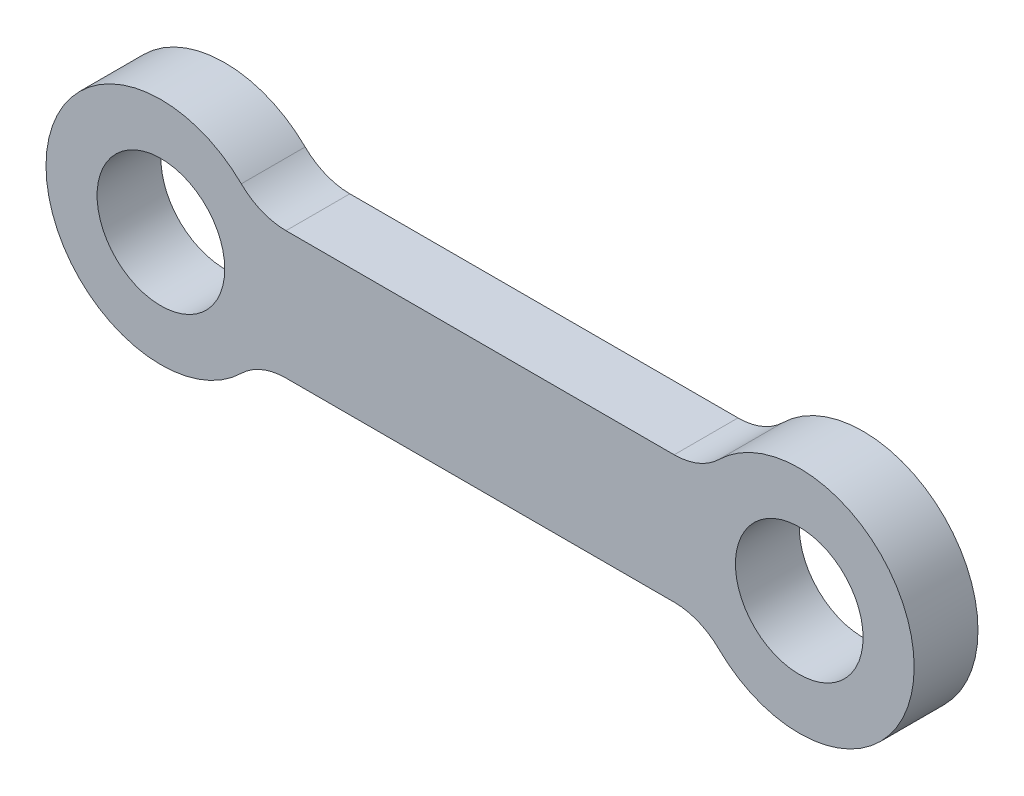
ISO-10303-21;
HEADER;
FILE_DESCRIPTION(('STEP AP214'),'2;1');
FILE_NAME('part.step','',(''),(''),'','','');
FILE_SCHEMA(('AUTOMOTIVE_DESIGN { 1 0 10303 214 1 1 1 1 }'));
ENDSEC;
DATA;
#1=APPLICATION_CONTEXT('core data for automotive mechanical design processes');
#2=APPLICATION_PROTOCOL_DEFINITION('international standard','automotive_design',2000,#1);
#3=PRODUCT_CONTEXT('',#1,'mechanical');
#4=PRODUCT('Part','Part','',(#3));
#5=PRODUCT_RELATED_PRODUCT_CATEGORY('part','',(#4));
#6=PRODUCT_DEFINITION_FORMATION('','',#4);
#7=PRODUCT_DEFINITION_CONTEXT('part definition',#1,'design');
#8=PRODUCT_DEFINITION('design','',#6,#7);
#9=PRODUCT_DEFINITION_SHAPE('','',#8);
#10=(LENGTH_UNIT() NAMED_UNIT(*) SI_UNIT(.MILLI.,.METRE.));
#11=(NAMED_UNIT(*) PLANE_ANGLE_UNIT() SI_UNIT($,.RADIAN.));
#12=(NAMED_UNIT(*) SI_UNIT($,.STERADIAN.) SOLID_ANGLE_UNIT());
#13=UNCERTAINTY_MEASURE_WITH_UNIT(LENGTH_MEASURE(1.E-05),#10,'distance_accuracy_value','');
#14=(GEOMETRIC_REPRESENTATION_CONTEXT(3) GLOBAL_UNCERTAINTY_ASSIGNED_CONTEXT((#13)) GLOBAL_UNIT_ASSIGNED_CONTEXT((#10,
#11,#12)) REPRESENTATION_CONTEXT('',''));
#15=CARTESIAN_POINT('',(0.,0.,0.));
#16=DIRECTION('',(0.,0.,1.));
#17=DIRECTION('',(1.,0.,0.));
#18=AXIS2_PLACEMENT_3D('',#15,#16,#17);
#19=CARTESIAN_POINT('',(40.2020410288673,10.,5.));
#20=DIRECTION('',(0.,0.,1.));
#21=DIRECTION('',(1.,0.,0.));
#22=AXIS2_PLACEMENT_3D('',#19,#20,#21);
#23=PLANE('',#22);
#24=CARTESIAN_POINT('',(0.,0.,5.));
#25=DIRECTION('',(0.,0.,1.));
#26=DIRECTION('',(1.,0.,0.));
#27=AXIS2_PLACEMENT_3D('',#24,#25,#26);
#28=CIRCLE('',#27,5.);
#29=CARTESIAN_POINT('',(5.,0.,5.));
#30=VERTEX_POINT('',#29);
#31=EDGE_CURVE('E134',#30,#30,#28,.T.);
#32=ORIENTED_EDGE('',*,*,#31,.F.);
#33=EDGE_LOOP('',(#32));
#34=FACE_BOUND('',#33,.T.);
#35=CARTESIAN_POINT('',(40.2020410288673,10.,5.));
#36=DIRECTION('',(0.,0.,-1.));
#37=DIRECTION('',(1.,0.,0.));
#38=AXIS2_PLACEMENT_3D('',#35,#36,#37);
#39=CIRCLE('',#38,5.);
#40=CARTESIAN_POINT('',(43.7013120899861,6.42857142857143,5.));
#41=VERTEX_POINT('',#40);
#42=CARTESIAN_POINT('',(40.2020410288673,5.,5.));
#43=VERTEX_POINT('',#42);
#44=EDGE_CURVE('E145',#41,#43,#39,.T.);
#45=ORIENTED_EDGE('',*,*,#44,.T.);
#46=DIRECTION('',(-1.,0.,0.));
#47=VECTOR('',#46,1.);
#48=CARTESIAN_POINT('',(9.79795897113271,5.,5.));
#49=LINE('',#48,#47);
#50=CARTESIAN_POINT('',(9.79795897113271,5.,5.));
#51=VERTEX_POINT('',#50);
#52=EDGE_CURVE('E93',#43,#51,#49,.T.);
#53=ORIENTED_EDGE('',*,*,#52,.T.);
#54=CARTESIAN_POINT('',(9.79795897113271,10.,5.));
#55=DIRECTION('',(0.,0.,-1.));
#56=DIRECTION('',(-1.,0.,0.));
#57=AXIS2_PLACEMENT_3D('',#54,#55,#56);
#58=CIRCLE('',#57,5.);
#59=CARTESIAN_POINT('',(6.29868791001389,6.42857142857143,5.));
#60=VERTEX_POINT('',#59);
#61=EDGE_CURVE('E160',#51,#60,#58,.T.);
#62=ORIENTED_EDGE('',*,*,#61,.T.);
#63=CARTESIAN_POINT('',(0.,0.,5.));
#64=DIRECTION('',(0.,0.,1.));
#65=DIRECTION('',(1.,0.,0.));
#66=AXIS2_PLACEMENT_3D('',#63,#64,#65);
#67=CIRCLE('',#66,9.);
#68=CARTESIAN_POINT('',(6.29868791001388,-6.42857142857143,5.));
#69=VERTEX_POINT('',#68);
#70=EDGE_CURVE('E173',#60,#69,#67,.T.);
#71=ORIENTED_EDGE('',*,*,#70,.T.);
#72=CARTESIAN_POINT('',(9.79795897113271,-10.,5.));
#73=DIRECTION('',(0.,0.,-1.));
#74=DIRECTION('',(1.,0.,0.));
#75=AXIS2_PLACEMENT_3D('',#72,#73,#74);
#76=CIRCLE('',#75,5.);
#77=CARTESIAN_POINT('',(9.79795897113271,-5.,5.));
#78=VERTEX_POINT('',#77);
#79=EDGE_CURVE('E112',#69,#78,#76,.T.);
#80=ORIENTED_EDGE('',*,*,#79,.T.);
#81=DIRECTION('',(1.,0.,0.));
#82=VECTOR('',#81,1.);
#83=CARTESIAN_POINT('',(9.79795897113271,-5.,5.));
#84=LINE('',#83,#82);
#85=CARTESIAN_POINT('',(40.2020410288673,-5.,5.));
#86=VERTEX_POINT('',#85);
#87=EDGE_CURVE('E106',#78,#86,#84,.T.);
#88=ORIENTED_EDGE('',*,*,#87,.T.);
#89=CARTESIAN_POINT('',(40.2020410288673,-10.,5.));
#90=DIRECTION('',(0.,0.,-1.));
#91=DIRECTION('',(-1.,0.,0.));
#92=AXIS2_PLACEMENT_3D('',#89,#90,#91);
#93=CIRCLE('',#92,5.);
#94=CARTESIAN_POINT('',(43.7013120899861,-6.42857142857143,5.));
#95=VERTEX_POINT('',#94);
#96=EDGE_CURVE('E110',#86,#95,#93,.T.);
#97=ORIENTED_EDGE('',*,*,#96,.T.);
#98=CARTESIAN_POINT('',(50.,0.,5.));
#99=DIRECTION('',(0.,0.,1.));
#100=DIRECTION('',(1.,0.,0.));
#101=AXIS2_PLACEMENT_3D('',#98,#99,#100);
#102=CIRCLE('',#101,9.00000000000001);
#103=EDGE_CURVE('E50',#95,#41,#102,.T.);
#104=ORIENTED_EDGE('',*,*,#103,.T.);
#105=EDGE_LOOP('',(#45,#53,#62,#71,#80,#88,#97,#104));
#106=FACE_BOUND('',#105,.T.);
#107=CARTESIAN_POINT('',(50.,0.,5.));
#108=DIRECTION('',(0.,0.,1.));
#109=DIRECTION('',(1.,0.,0.));
#110=AXIS2_PLACEMENT_3D('',#107,#108,#109);
#111=CIRCLE('',#110,5.);
#112=CARTESIAN_POINT('',(55.,0.,5.));
#113=VERTEX_POINT('',#112);
#114=EDGE_CURVE('E182',#113,#113,#111,.T.);
#115=ORIENTED_EDGE('',*,*,#114,.F.);
#116=EDGE_LOOP('',(#115));
#117=FACE_BOUND('',#116,.T.);
#118=ADVANCED_FACE('F33',(#34,#106,#117),#23,.T.);
#119=CARTESIAN_POINT('',(40.2020410288673,10.,0.));
#120=DIRECTION('',(0.,0.,1.));
#121=DIRECTION('',(1.,0.,0.));
#122=AXIS2_PLACEMENT_3D('',#119,#120,#121);
#123=PLANE('',#122);
#124=CARTESIAN_POINT('',(40.2020410288673,10.,0.));
#125=DIRECTION('',(0.,0.,-1.));
#126=DIRECTION('',(1.,0.,0.));
#127=AXIS2_PLACEMENT_3D('',#124,#125,#126);
#128=CIRCLE('',#127,5.);
#129=CARTESIAN_POINT('',(43.7013120899861,6.42857142857143,0.));
#130=VERTEX_POINT('',#129);
#131=CARTESIAN_POINT('',(40.2020410288673,5.,0.));
#132=VERTEX_POINT('',#131);
#133=EDGE_CURVE('E130',#130,#132,#128,.T.);
#134=ORIENTED_EDGE('',*,*,#133,.F.);
#135=CARTESIAN_POINT('',(50.,0.,0.));
#136=DIRECTION('',(0.,0.,1.));
#137=DIRECTION('',(1.,0.,0.));
#138=AXIS2_PLACEMENT_3D('',#135,#136,#137);
#139=CIRCLE('',#138,9.00000000000001);
#140=CARTESIAN_POINT('',(43.7013120899861,-6.42857142857143,0.));
#141=VERTEX_POINT('',#140);
#142=EDGE_CURVE('E85',#141,#130,#139,.T.);
#143=ORIENTED_EDGE('',*,*,#142,.F.);
#144=CARTESIAN_POINT('',(40.2020410288673,-10.,0.));
#145=DIRECTION('',(0.,0.,-1.));
#146=DIRECTION('',(-1.,0.,0.));
#147=AXIS2_PLACEMENT_3D('',#144,#145,#146);
#148=CIRCLE('',#147,5.);
#149=CARTESIAN_POINT('',(40.2020410288673,-5.,0.));
#150=VERTEX_POINT('',#149);
#151=EDGE_CURVE('E79',#150,#141,#148,.T.);
#152=ORIENTED_EDGE('',*,*,#151,.F.);
#153=DIRECTION('',(1.,0.,0.));
#154=VECTOR('',#153,1.);
#155=CARTESIAN_POINT('',(9.79795897113271,-5.,0.));
#156=LINE('',#155,#154);
#157=CARTESIAN_POINT('',(9.79795897113271,-5.,0.));
#158=VERTEX_POINT('',#157);
#159=EDGE_CURVE('E120',#158,#150,#156,.T.);
#160=ORIENTED_EDGE('',*,*,#159,.F.);
#161=CARTESIAN_POINT('',(9.79795897113271,-10.,0.));
#162=DIRECTION('',(0.,0.,-1.));
#163=DIRECTION('',(1.,0.,0.));
#164=AXIS2_PLACEMENT_3D('',#161,#162,#163);
#165=CIRCLE('',#164,5.);
#166=CARTESIAN_POINT('',(6.29868791001388,-6.42857142857143,0.));
#167=VERTEX_POINT('',#166);
#168=EDGE_CURVE('E140',#167,#158,#165,.T.);
#169=ORIENTED_EDGE('',*,*,#168,.F.);
#170=CARTESIAN_POINT('',(0.,0.,0.));
#171=DIRECTION('',(0.,0.,1.));
#172=DIRECTION('',(1.,0.,0.));
#173=AXIS2_PLACEMENT_3D('',#170,#171,#172);
#174=CIRCLE('',#173,9.);
#175=CARTESIAN_POINT('',(6.29868791001389,6.42857142857143,0.));
#176=VERTEX_POINT('',#175);
#177=EDGE_CURVE('E138',#176,#167,#174,.T.);
#178=ORIENTED_EDGE('',*,*,#177,.F.);
#179=CARTESIAN_POINT('',(9.79795897113271,10.,0.));
#180=DIRECTION('',(0.,0.,-1.));
#181=DIRECTION('',(-1.,0.,0.));
#182=AXIS2_PLACEMENT_3D('',#179,#180,#181);
#183=CIRCLE('',#182,5.);
#184=CARTESIAN_POINT('',(9.79795897113271,5.,0.));
#185=VERTEX_POINT('',#184);
#186=EDGE_CURVE('E136',#185,#176,#183,.T.);
#187=ORIENTED_EDGE('',*,*,#186,.F.);
#188=DIRECTION('',(-1.,0.,0.));
#189=VECTOR('',#188,1.);
#190=CARTESIAN_POINT('',(9.79795897113271,5.,0.));
#191=LINE('',#190,#189);
#192=EDGE_CURVE('E133',#132,#185,#191,.T.);
#193=ORIENTED_EDGE('',*,*,#192,.F.);
#194=EDGE_LOOP('',(#134,#143,#152,#160,#169,#178,#187,#193));
#195=FACE_BOUND('',#194,.T.);
#196=CARTESIAN_POINT('',(0.,0.,0.));
#197=DIRECTION('',(0.,0.,1.));
#198=DIRECTION('',(1.,0.,0.));
#199=AXIS2_PLACEMENT_3D('',#196,#197,#198);
#200=CIRCLE('',#199,5.);
#201=CARTESIAN_POINT('',(5.,0.,0.));
#202=VERTEX_POINT('',#201);
#203=EDGE_CURVE('E179',#202,#202,#200,.T.);
#204=ORIENTED_EDGE('',*,*,#203,.T.);
#205=EDGE_LOOP('',(#204));
#206=FACE_BOUND('',#205,.T.);
#207=CARTESIAN_POINT('',(50.,0.,0.));
#208=DIRECTION('',(0.,0.,1.));
#209=DIRECTION('',(1.,0.,0.));
#210=AXIS2_PLACEMENT_3D('',#207,#208,#209);
#211=CIRCLE('',#210,5.);
#212=CARTESIAN_POINT('',(55.,0.,0.));
#213=VERTEX_POINT('',#212);
#214=EDGE_CURVE('E185',#213,#213,#211,.T.);
#215=ORIENTED_EDGE('',*,*,#214,.T.);
#216=EDGE_LOOP('',(#215));
#217=FACE_BOUND('',#216,.T.);
#218=ADVANCED_FACE('F164',(#195,#206,#217),#123,.F.);
#219=CARTESIAN_POINT('',(40.2020410288673,10.,5.));
#220=DIRECTION('',(0.,0.,-1.));
#221=DIRECTION('',(-1.,0.,0.));
#222=AXIS2_PLACEMENT_3D('',#219,#220,#221);
#223=CYLINDRICAL_SURFACE('',#222,5.);
#224=ORIENTED_EDGE('',*,*,#133,.T.);
#225=DIRECTION('',(0.,0.,-1.));
#226=VECTOR('',#225,1.);
#227=CARTESIAN_POINT('',(40.2020410288673,5.,5.));
#228=LINE('',#227,#226);
#229=EDGE_CURVE('E11',#43,#132,#228,.T.);
#230=ORIENTED_EDGE('',*,*,#229,.F.);
#231=ORIENTED_EDGE('',*,*,#44,.F.);
#232=DIRECTION('',(0.,0.,-1.));
#233=VECTOR('',#232,1.);
#234=CARTESIAN_POINT('',(43.7013120899861,6.42857142857143,5.));
#235=LINE('',#234,#233);
#236=EDGE_CURVE('E126',#41,#130,#235,.T.);
#237=ORIENTED_EDGE('',*,*,#236,.T.);
#238=EDGE_LOOP('',(#224,#230,#231,#237));
#239=FACE_BOUND('',#238,.T.);
#240=ADVANCED_FACE('F35',(#239),#223,.F.);
#241=CARTESIAN_POINT('',(9.79795897113271,5.,5.));
#242=DIRECTION('',(0.,-1.,0.));
#243=DIRECTION('',(1.,0.,0.));
#244=AXIS2_PLACEMENT_3D('',#241,#242,#243);
#245=PLANE('',#244);
#246=ORIENTED_EDGE('',*,*,#192,.T.);
#247=DIRECTION('',(0.,0.,-1.));
#248=VECTOR('',#247,1.);
#249=CARTESIAN_POINT('',(9.79795897113271,5.,5.));
#250=LINE('',#249,#248);
#251=EDGE_CURVE('E42',#51,#185,#250,.T.);
#252=ORIENTED_EDGE('',*,*,#251,.F.);
#253=ORIENTED_EDGE('',*,*,#52,.F.);
#254=ORIENTED_EDGE('',*,*,#229,.T.);
#255=EDGE_LOOP('',(#246,#252,#253,#254));
#256=FACE_BOUND('',#255,.T.);
#257=ADVANCED_FACE('F217',(#256),#245,.F.);
#258=CARTESIAN_POINT('',(9.79795897113271,10.,5.));
#259=DIRECTION('',(0.,0.,-1.));
#260=DIRECTION('',(-1.,0.,0.));
#261=AXIS2_PLACEMENT_3D('',#258,#259,#260);
#262=CYLINDRICAL_SURFACE('',#261,5.);
#263=ORIENTED_EDGE('',*,*,#186,.T.);
#264=DIRECTION('',(0.,0.,-1.));
#265=VECTOR('',#264,1.);
#266=CARTESIAN_POINT('',(6.29868791001389,6.42857142857143,5.));
#267=LINE('',#266,#265);
#268=EDGE_CURVE('E152',#60,#176,#267,.T.);
#269=ORIENTED_EDGE('',*,*,#268,.F.);
#270=ORIENTED_EDGE('',*,*,#61,.F.);
#271=ORIENTED_EDGE('',*,*,#251,.T.);
#272=EDGE_LOOP('',(#263,#269,#270,#271));
#273=FACE_BOUND('',#272,.T.);
#274=ADVANCED_FACE('F158',(#273),#262,.F.);
#275=CARTESIAN_POINT('',(0.,0.,5.));
#276=DIRECTION('',(0.,0.,-1.));
#277=DIRECTION('',(-1.,0.,0.));
#278=AXIS2_PLACEMENT_3D('',#275,#276,#277);
#279=CYLINDRICAL_SURFACE('',#278,9.);
#280=ORIENTED_EDGE('',*,*,#177,.T.);
#281=DIRECTION('',(0.,0.,-1.));
#282=VECTOR('',#281,1.);
#283=CARTESIAN_POINT('',(6.29868791001388,-6.42857142857143,5.));
#284=LINE('',#283,#282);
#285=EDGE_CURVE('E149',#69,#167,#284,.T.);
#286=ORIENTED_EDGE('',*,*,#285,.F.);
#287=ORIENTED_EDGE('',*,*,#70,.F.);
#288=ORIENTED_EDGE('',*,*,#268,.T.);
#289=EDGE_LOOP('',(#280,#286,#287,#288));
#290=FACE_BOUND('',#289,.T.);
#291=ADVANCED_FACE('F169',(#290),#279,.T.);
#292=CARTESIAN_POINT('',(9.79795897113271,-10.,5.));
#293=DIRECTION('',(0.,0.,-1.));
#294=DIRECTION('',(-1.,0.,0.));
#295=AXIS2_PLACEMENT_3D('',#292,#293,#294);
#296=CYLINDRICAL_SURFACE('',#295,5.);
#297=ORIENTED_EDGE('',*,*,#168,.T.);
#298=DIRECTION('',(0.,0.,-1.));
#299=VECTOR('',#298,1.);
#300=CARTESIAN_POINT('',(9.79795897113271,-5.,5.));
#301=LINE('',#300,#299);
#302=EDGE_CURVE('E121',#78,#158,#301,.T.);
#303=ORIENTED_EDGE('',*,*,#302,.F.);
#304=ORIENTED_EDGE('',*,*,#79,.F.);
#305=ORIENTED_EDGE('',*,*,#285,.T.);
#306=EDGE_LOOP('',(#297,#303,#304,#305));
#307=FACE_BOUND('',#306,.T.);
#308=ADVANCED_FACE('F172',(#307),#296,.F.);
#309=CARTESIAN_POINT('',(9.79795897113271,-5.,5.));
#310=DIRECTION('',(0.,1.,0.));
#311=DIRECTION('',(-1.,0.,0.));
#312=AXIS2_PLACEMENT_3D('',#309,#310,#311);
#313=PLANE('',#312);
#314=ORIENTED_EDGE('',*,*,#159,.T.);
#315=DIRECTION('',(0.,0.,-1.));
#316=VECTOR('',#315,1.);
#317=CARTESIAN_POINT('',(40.2020410288673,-5.,5.));
#318=LINE('',#317,#316);
#319=EDGE_CURVE('E117',#86,#150,#318,.T.);
#320=ORIENTED_EDGE('',*,*,#319,.F.);
#321=ORIENTED_EDGE('',*,*,#87,.F.);
#322=ORIENTED_EDGE('',*,*,#302,.T.);
#323=EDGE_LOOP('',(#314,#320,#321,#322));
#324=FACE_BOUND('',#323,.T.);
#325=ADVANCED_FACE('F118',(#324),#313,.F.);
#326=CARTESIAN_POINT('',(40.2020410288673,-10.,5.));
#327=DIRECTION('',(0.,0.,-1.));
#328=DIRECTION('',(-1.,0.,0.));
#329=AXIS2_PLACEMENT_3D('',#326,#327,#328);
#330=CYLINDRICAL_SURFACE('',#329,5.);
#331=ORIENTED_EDGE('',*,*,#151,.T.);
#332=DIRECTION('',(0.,0.,-1.));
#333=VECTOR('',#332,1.);
#334=CARTESIAN_POINT('',(43.7013120899861,-6.42857142857143,5.));
#335=LINE('',#334,#333);
#336=EDGE_CURVE('E122',#95,#141,#335,.T.);
#337=ORIENTED_EDGE('',*,*,#336,.F.);
#338=ORIENTED_EDGE('',*,*,#96,.F.);
#339=ORIENTED_EDGE('',*,*,#319,.T.);
#340=EDGE_LOOP('',(#331,#337,#338,#339));
#341=FACE_BOUND('',#340,.T.);
#342=ADVANCED_FACE('F124',(#341),#330,.F.);
#343=CARTESIAN_POINT('',(50.,0.,5.));
#344=DIRECTION('',(0.,0.,-1.));
#345=DIRECTION('',(-1.,0.,0.));
#346=AXIS2_PLACEMENT_3D('',#343,#344,#345);
#347=CYLINDRICAL_SURFACE('',#346,9.00000000000001);
#348=ORIENTED_EDGE('',*,*,#142,.T.);
#349=ORIENTED_EDGE('',*,*,#236,.F.);
#350=ORIENTED_EDGE('',*,*,#103,.F.);
#351=ORIENTED_EDGE('',*,*,#336,.T.);
#352=EDGE_LOOP('',(#348,#349,#350,#351));
#353=FACE_BOUND('',#352,.T.);
#354=ADVANCED_FACE('F205',(#353),#347,.T.);
#355=CARTESIAN_POINT('',(0.,0.,5.));
#356=DIRECTION('',(0.,0.,-1.));
#357=DIRECTION('',(-1.,0.,0.));
#358=AXIS2_PLACEMENT_3D('',#355,#356,#357);
#359=CYLINDRICAL_SURFACE('',#358,5.);
#360=ORIENTED_EDGE('',*,*,#31,.T.);
#361=EDGE_LOOP('',(#360));
#362=FACE_BOUND('',#361,.T.);
#363=ORIENTED_EDGE('',*,*,#203,.F.);
#364=EDGE_LOOP('',(#363));
#365=FACE_BOUND('',#364,.T.);
#366=ADVANCED_FACE('F202',(#362,#365),#359,.F.);
#367=CARTESIAN_POINT('',(50.,0.,5.));
#368=DIRECTION('',(0.,0.,-1.));
#369=DIRECTION('',(-1.,0.,0.));
#370=AXIS2_PLACEMENT_3D('',#367,#368,#369);
#371=CYLINDRICAL_SURFACE('',#370,5.);
#372=ORIENTED_EDGE('',*,*,#114,.T.);
#373=EDGE_LOOP('',(#372));
#374=FACE_BOUND('',#373,.T.);
#375=ORIENTED_EDGE('',*,*,#214,.F.);
#376=EDGE_LOOP('',(#375));
#377=FACE_BOUND('',#376,.T.);
#378=ADVANCED_FACE('F191',(#374,#377),#371,.F.);
#379=CLOSED_SHELL('',(#118,#218,#240,#257,#274,#291,#308,#325,#342,#354,#366,#378));
#380=MANIFOLD_SOLID_BREP('B2',#379);
#381=ADVANCED_BREP_SHAPE_REPRESENTATION('',(#18,#380),#14);
#382=SHAPE_DEFINITION_REPRESENTATION(#9,#381);
ENDSEC;
END-ISO-10303-21;
